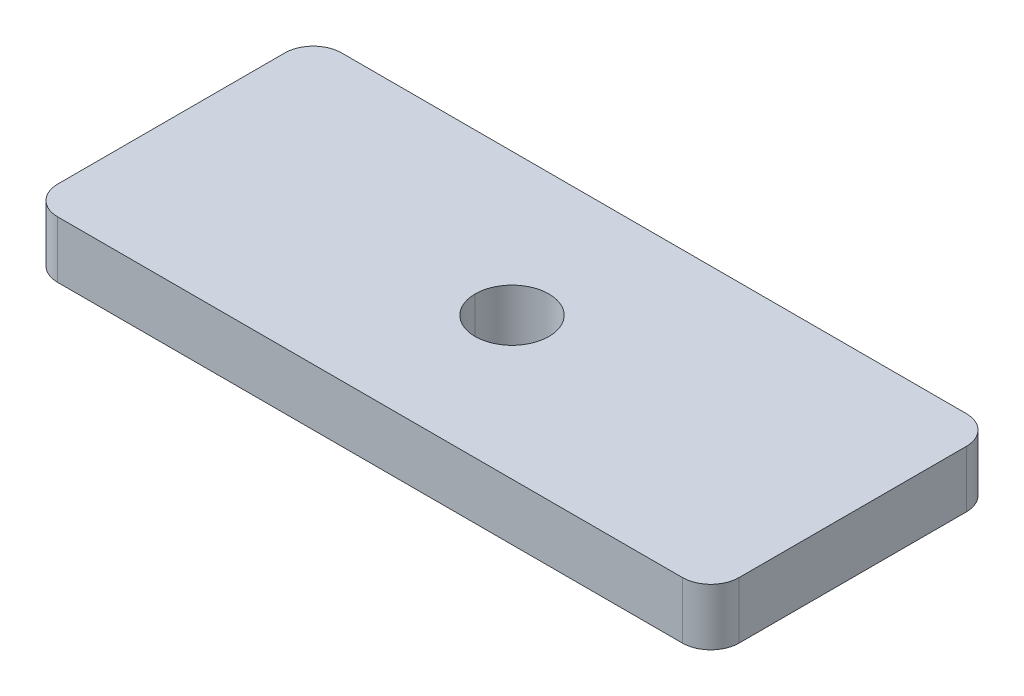
ISO-10303-21;
HEADER;
FILE_DESCRIPTION(('STEP AP214'),'2;1');
FILE_NAME('part.step','',(''),(''),'','','');
FILE_SCHEMA(('AUTOMOTIVE_DESIGN { 1 0 10303 214 1 1 1 1 }'));
ENDSEC;
DATA;
#1=APPLICATION_CONTEXT('core data for automotive mechanical design processes');
#2=APPLICATION_PROTOCOL_DEFINITION('international standard','automotive_design',2000,#1);
#3=PRODUCT_CONTEXT('',#1,'mechanical');
#4=PRODUCT('Part','Part','',(#3));
#5=PRODUCT_RELATED_PRODUCT_CATEGORY('part','',(#4));
#6=PRODUCT_DEFINITION_FORMATION('','',#4);
#7=PRODUCT_DEFINITION_CONTEXT('part definition',#1,'design');
#8=PRODUCT_DEFINITION('design','',#6,#7);
#9=PRODUCT_DEFINITION_SHAPE('','',#8);
#10=(LENGTH_UNIT() NAMED_UNIT(*) SI_UNIT(.MILLI.,.METRE.));
#11=(NAMED_UNIT(*) PLANE_ANGLE_UNIT() SI_UNIT($,.RADIAN.));
#12=(NAMED_UNIT(*) SI_UNIT($,.STERADIAN.) SOLID_ANGLE_UNIT());
#13=UNCERTAINTY_MEASURE_WITH_UNIT(LENGTH_MEASURE(1.E-05),#10,'distance_accuracy_value','');
#14=(GEOMETRIC_REPRESENTATION_CONTEXT(3) GLOBAL_UNCERTAINTY_ASSIGNED_CONTEXT((#13)) GLOBAL_UNIT_ASSIGNED_CONTEXT((#10,
#11,#12)) REPRESENTATION_CONTEXT('',''));
#15=CARTESIAN_POINT('',(0.,0.,0.));
#16=DIRECTION('',(0.,0.,1.));
#17=DIRECTION('',(1.,0.,0.));
#18=AXIS2_PLACEMENT_3D('',#15,#16,#17);
#19=CARTESIAN_POINT('',(-244.16652551426,214.2245784726,10.999999809517));
#20=DIRECTION('',(0.,1.,0.));
#21=DIRECTION('',(-1.,0.,0.));
#22=AXIS2_PLACEMENT_3D('',#19,#20,#21);
#23=CYLINDRICAL_SURFACE('',#22,1.3);
#24=CARTESIAN_POINT('',(-244.16652551426,216.4245808726,10.999999809517));
#25=DIRECTION('',(0.,-1.,0.));
#26=DIRECTION('',(1.,0.,0.));
#27=AXIS2_PLACEMENT_3D('',#24,#25,#26);
#28=CIRCLE('',#27,1.3);
#29=CARTESIAN_POINT('',(-242.86652551426,216.4245808726,10.999999809517));
#30=VERTEX_POINT('',#29);
#31=CARTESIAN_POINT('',(-245.46652551426,216.4245808726,10.999999809517));
#32=VERTEX_POINT('',#31);
#33=EDGE_CURVE('E200',#30,#32,#28,.T.);
#34=ORIENTED_EDGE('',*,*,#33,.F.);
#35=DIRECTION('',(0.,-1.,0.));
#36=VECTOR('',#35,1.);
#37=CARTESIAN_POINT('',(-242.86652551426,216.4245808726,10.999999809517));
#38=LINE('',#37,#36);
#39=CARTESIAN_POINT('',(-242.86652551426,214.4245808726,10.999999809517));
#40=VERTEX_POINT('',#39);
#41=EDGE_CURVE('E23',#30,#40,#38,.T.);
#42=ORIENTED_EDGE('',*,*,#41,.T.);
#43=CARTESIAN_POINT('',(-244.16652551426,214.4245808726,10.999999809517));
#44=DIRECTION('',(0.,1.,0.));
#45=DIRECTION('',(-1.,0.,0.));
#46=AXIS2_PLACEMENT_3D('',#43,#44,#45);
#47=CIRCLE('',#46,1.3);
#48=CARTESIAN_POINT('',(-245.46652551426,214.4245808726,10.999999809517));
#49=VERTEX_POINT('',#48);
#50=EDGE_CURVE('E114',#49,#40,#47,.T.);
#51=ORIENTED_EDGE('',*,*,#50,.F.);
#52=DIRECTION('',(0.,-1.,0.));
#53=VECTOR('',#52,1.);
#54=CARTESIAN_POINT('',(-245.46652551426,216.4245808726,10.999999809517));
#55=LINE('',#54,#53);
#56=EDGE_CURVE('E10',#32,#49,#55,.T.);
#57=ORIENTED_EDGE('',*,*,#56,.F.);
#58=EDGE_LOOP('',(#34,#42,#51,#57));
#59=FACE_BOUND('',#58,.T.);
#60=ADVANCED_FACE('F15',(#59),#23,.F.);
#61=CARTESIAN_POINT('',(-244.16652551426,214.2245784726,10.999999809517));
#62=DIRECTION('',(0.,1.,0.));
#63=DIRECTION('',(-1.,0.,0.));
#64=AXIS2_PLACEMENT_3D('',#61,#62,#63);
#65=CYLINDRICAL_SURFACE('',#64,1.3);
#66=ORIENTED_EDGE('',*,*,#41,.F.);
#67=CARTESIAN_POINT('',(-244.16652551426,216.4245808726,10.999999809517));
#68=DIRECTION('',(0.,-1.,0.));
#69=DIRECTION('',(-1.,0.,0.));
#70=AXIS2_PLACEMENT_3D('',#67,#68,#69);
#71=CIRCLE('',#70,1.3);
#72=EDGE_CURVE('E204',#32,#30,#71,.T.);
#73=ORIENTED_EDGE('',*,*,#72,.F.);
#74=ORIENTED_EDGE('',*,*,#56,.T.);
#75=CARTESIAN_POINT('',(-244.16652551426,214.4245808726,10.999999809517));
#76=DIRECTION('',(0.,1.,0.));
#77=DIRECTION('',(1.,0.,0.));
#78=AXIS2_PLACEMENT_3D('',#75,#76,#77);
#79=CIRCLE('',#78,1.3);
#80=EDGE_CURVE('E151',#40,#49,#79,.T.);
#81=ORIENTED_EDGE('',*,*,#80,.F.);
#82=EDGE_LOOP('',(#66,#73,#74,#81));
#83=FACE_BOUND('',#82,.T.);
#84=ADVANCED_FACE('F209',(#83),#65,.F.);
#85=CARTESIAN_POINT('',(-233.33616287996,216.4245808726,14.391526076047));
#86=DIRECTION('',(0.,1.,0.));
#87=DIRECTION('',(0.,0.,-1.));
#88=AXIS2_PLACEMENT_3D('',#85,#86,#87);
#89=PLANE('',#88);
#90=ORIENTED_EDGE('',*,*,#33,.T.);
#91=ORIENTED_EDGE('',*,*,#72,.T.);
#92=EDGE_LOOP('',(#90,#91));
#93=FACE_BOUND('',#92,.T.);
#94=CARTESIAN_POINT('',(-255.16652551426,216.4245808726,14.999999809517));
#95=DIRECTION('',(0.,1.,0.));
#96=DIRECTION('',(-1.,0.,0.));
#97=AXIS2_PLACEMENT_3D('',#94,#95,#96);
#98=CIRCLE('',#97,1.);
#99=CARTESIAN_POINT('',(-256.16652551426,216.4245808726,14.999999809517));
#100=VERTEX_POINT('',#99);
#101=CARTESIAN_POINT('',(-255.16652551426,216.4245808726,15.999999809517));
#102=VERTEX_POINT('',#101);
#103=EDGE_CURVE('E183',#100,#102,#98,.T.);
#104=ORIENTED_EDGE('',*,*,#103,.T.);
#105=DIRECTION('',(1.,0.,0.));
#106=VECTOR('',#105,1.);
#107=CARTESIAN_POINT('',(-255.16652551426,216.4245808726,15.999999809517));
#108=LINE('',#107,#106);
#109=CARTESIAN_POINT('',(-233.16652551426,216.4245808726,15.999999809517));
#110=VERTEX_POINT('',#109);
#111=EDGE_CURVE('E176',#102,#110,#108,.T.);
#112=ORIENTED_EDGE('',*,*,#111,.T.);
#113=CARTESIAN_POINT('',(-233.16652551426,216.4245808726,14.999999809517));
#114=DIRECTION('',(0.,1.,0.));
#115=DIRECTION('',(0.,0.,1.));
#116=AXIS2_PLACEMENT_3D('',#113,#114,#115);
#117=CIRCLE('',#116,1.);
#118=CARTESIAN_POINT('',(-232.16652551426,216.4245808726,14.999999809517));
#119=VERTEX_POINT('',#118);
#120=EDGE_CURVE('E170',#110,#119,#117,.T.);
#121=ORIENTED_EDGE('',*,*,#120,.T.);
#122=DIRECTION('',(0.,0.,1.));
#123=VECTOR('',#122,1.);
#124=CARTESIAN_POINT('',(-232.16652551426,216.4245808726,6.999999809517));
#125=LINE('',#124,#123);
#126=CARTESIAN_POINT('',(-232.16652551426,216.4245808726,6.999999809517));
#127=VERTEX_POINT('',#126);
#128=EDGE_CURVE('E143',#127,#119,#125,.T.);
#129=ORIENTED_EDGE('',*,*,#128,.F.);
#130=CARTESIAN_POINT('',(-233.16652551426,216.4245808726,6.999999809517));
#131=DIRECTION('',(0.,1.,0.));
#132=DIRECTION('',(1.,0.,0.));
#133=AXIS2_PLACEMENT_3D('',#130,#131,#132);
#134=CIRCLE('',#133,1.);
#135=CARTESIAN_POINT('',(-233.16652551426,216.4245808726,5.999999809517));
#136=VERTEX_POINT('',#135);
#137=EDGE_CURVE('E103',#127,#136,#134,.T.);
#138=ORIENTED_EDGE('',*,*,#137,.T.);
#139=DIRECTION('',(-1.,0.,0.));
#140=VECTOR('',#139,1.);
#141=CARTESIAN_POINT('',(-233.16652551426,216.4245808726,5.999999809517));
#142=LINE('',#141,#140);
#143=CARTESIAN_POINT('',(-255.16652551426,216.4245808726,5.999999809517));
#144=VERTEX_POINT('',#143);
#145=EDGE_CURVE('E98',#136,#144,#142,.T.);
#146=ORIENTED_EDGE('',*,*,#145,.T.);
#147=CARTESIAN_POINT('',(-255.16652551426,216.4245808726,6.999999809517));
#148=DIRECTION('',(0.,1.,0.));
#149=DIRECTION('',(0.,0.,-1.));
#150=AXIS2_PLACEMENT_3D('',#147,#148,#149);
#151=CIRCLE('',#150,1.);
#152=CARTESIAN_POINT('',(-256.16652551426,216.4245808726,6.999999809517));
#153=VERTEX_POINT('',#152);
#154=EDGE_CURVE('E197',#144,#153,#151,.T.);
#155=ORIENTED_EDGE('',*,*,#154,.T.);
#156=DIRECTION('',(0.,0.,-1.));
#157=VECTOR('',#156,1.);
#158=CARTESIAN_POINT('',(-256.16652551426,216.4245808726,14.999999809517));
#159=LINE('',#158,#157);
#160=EDGE_CURVE('E189',#100,#153,#159,.T.);
#161=ORIENTED_EDGE('',*,*,#160,.F.);
#162=EDGE_LOOP('',(#104,#112,#121,#129,#138,#146,#155,#161));
#163=FACE_BOUND('',#162,.T.);
#164=ADVANCED_FACE('F222',(#93,#163),#89,.T.);
#165=CARTESIAN_POINT('',(-255.16652551426,214.4245808726,6.999999809517));
#166=DIRECTION('',(0.,1.,0.));
#167=DIRECTION('',(-1.,0.,0.));
#168=AXIS2_PLACEMENT_3D('',#165,#166,#167);
#169=CYLINDRICAL_SURFACE('',#168,1.);
#170=CARTESIAN_POINT('',(-255.16652551426,214.4245808726,6.999999809517));
#171=DIRECTION('',(0.,-1.,0.));
#172=DIRECTION('',(-1.,0.,0.));
#173=AXIS2_PLACEMENT_3D('',#170,#171,#172);
#174=CIRCLE('',#173,1.);
#175=CARTESIAN_POINT('',(-256.16652551426,214.4245808726,6.999999809517));
#176=VERTEX_POINT('',#175);
#177=CARTESIAN_POINT('',(-255.16652551426,214.4245808726,5.999999809517));
#178=VERTEX_POINT('',#177);
#179=EDGE_CURVE('E112',#176,#178,#174,.T.);
#180=ORIENTED_EDGE('',*,*,#179,.F.);
#181=DIRECTION('',(0.,1.,0.));
#182=VECTOR('',#181,1.);
#183=CARTESIAN_POINT('',(-256.16652551426,214.4245808726,6.999999809517));
#184=LINE('',#183,#182);
#185=EDGE_CURVE('E193',#176,#153,#184,.T.);
#186=ORIENTED_EDGE('',*,*,#185,.T.);
#187=ORIENTED_EDGE('',*,*,#154,.F.);
#188=DIRECTION('',(0.,-1.,0.));
#189=VECTOR('',#188,1.);
#190=CARTESIAN_POINT('',(-255.16652551426,216.4245808726,5.999999809517));
#191=LINE('',#190,#189);
#192=EDGE_CURVE('E158',#144,#178,#191,.T.);
#193=ORIENTED_EDGE('',*,*,#192,.T.);
#194=EDGE_LOOP('',(#180,#186,#187,#193));
#195=FACE_BOUND('',#194,.T.);
#196=ADVANCED_FACE('F227',(#195),#169,.T.);
#197=CARTESIAN_POINT('',(-256.16652551426,214.4245808726,15.999999809517));
#198=DIRECTION('',(-1.,0.,0.));
#199=DIRECTION('',(0.,-1.,0.));
#200=AXIS2_PLACEMENT_3D('',#197,#198,#199);
#201=PLANE('',#200);
#202=ORIENTED_EDGE('',*,*,#160,.T.);
#203=ORIENTED_EDGE('',*,*,#185,.F.);
#204=DIRECTION('',(0.,0.,-1.));
#205=VECTOR('',#204,1.);
#206=CARTESIAN_POINT('',(-256.16652551426,214.4245808726,14.999999809517));
#207=LINE('',#206,#205);
#208=CARTESIAN_POINT('',(-256.16652551426,214.4245808726,14.999999809517));
#209=VERTEX_POINT('',#208);
#210=EDGE_CURVE('E131',#209,#176,#207,.T.);
#211=ORIENTED_EDGE('',*,*,#210,.F.);
#212=DIRECTION('',(0.,-1.,0.));
#213=VECTOR('',#212,1.);
#214=CARTESIAN_POINT('',(-256.16652551426,216.4245808726,14.999999809517));
#215=LINE('',#214,#213);
#216=EDGE_CURVE('E186',#100,#209,#215,.T.);
#217=ORIENTED_EDGE('',*,*,#216,.F.);
#218=EDGE_LOOP('',(#202,#203,#211,#217));
#219=FACE_BOUND('',#218,.T.);
#220=ADVANCED_FACE('F231',(#219),#201,.T.);
#221=CARTESIAN_POINT('',(-255.16652551426,214.4245808726,14.999999809517));
#222=DIRECTION('',(0.,1.,0.));
#223=DIRECTION('',(-1.,0.,0.));
#224=AXIS2_PLACEMENT_3D('',#221,#222,#223);
#225=CYLINDRICAL_SURFACE('',#224,1.);
#226=CARTESIAN_POINT('',(-255.16652551426,214.4245808726,14.999999809517));
#227=DIRECTION('',(0.,-1.,0.));
#228=DIRECTION('',(0.,0.,1.));
#229=AXIS2_PLACEMENT_3D('',#226,#227,#228);
#230=CIRCLE('',#229,1.);
#231=CARTESIAN_POINT('',(-255.16652551426,214.4245808726,15.999999809517));
#232=VERTEX_POINT('',#231);
#233=EDGE_CURVE('E132',#232,#209,#230,.T.);
#234=ORIENTED_EDGE('',*,*,#233,.F.);
#235=DIRECTION('',(0.,1.,0.));
#236=VECTOR('',#235,1.);
#237=CARTESIAN_POINT('',(-255.16652551426,214.4245808726,15.999999809517));
#238=LINE('',#237,#236);
#239=EDGE_CURVE('E179',#232,#102,#238,.T.);
#240=ORIENTED_EDGE('',*,*,#239,.T.);
#241=ORIENTED_EDGE('',*,*,#103,.F.);
#242=ORIENTED_EDGE('',*,*,#216,.T.);
#243=EDGE_LOOP('',(#234,#240,#241,#242));
#244=FACE_BOUND('',#243,.T.);
#245=ADVANCED_FACE('F238',(#244),#225,.T.);
#246=CARTESIAN_POINT('',(-226.66652551426,214.4245808726,15.999999809517));
#247=DIRECTION('',(0.,0.,1.));
#248=DIRECTION('',(-1.,0.,0.));
#249=AXIS2_PLACEMENT_3D('',#246,#247,#248);
#250=PLANE('',#249);
#251=ORIENTED_EDGE('',*,*,#111,.F.);
#252=ORIENTED_EDGE('',*,*,#239,.F.);
#253=DIRECTION('',(1.,0.,0.));
#254=VECTOR('',#253,1.);
#255=CARTESIAN_POINT('',(-255.16652551426,214.4245808726,15.999999809517));
#256=LINE('',#255,#254);
#257=CARTESIAN_POINT('',(-233.16652551426,214.4245808726,15.999999809517));
#258=VERTEX_POINT('',#257);
#259=EDGE_CURVE('E138',#232,#258,#256,.T.);
#260=ORIENTED_EDGE('',*,*,#259,.T.);
#261=DIRECTION('',(0.,-1.,0.));
#262=VECTOR('',#261,1.);
#263=CARTESIAN_POINT('',(-233.16652551426,216.4245808726,15.999999809517));
#264=LINE('',#263,#262);
#265=EDGE_CURVE('E173',#110,#258,#264,.T.);
#266=ORIENTED_EDGE('',*,*,#265,.F.);
#267=EDGE_LOOP('',(#251,#252,#260,#266));
#268=FACE_BOUND('',#267,.T.);
#269=ADVANCED_FACE('F255',(#268),#250,.T.);
#270=CARTESIAN_POINT('',(-233.16652551426,214.4245808726,14.999999809517));
#271=DIRECTION('',(0.,1.,0.));
#272=DIRECTION('',(-1.,0.,0.));
#273=AXIS2_PLACEMENT_3D('',#270,#271,#272);
#274=CYLINDRICAL_SURFACE('',#273,1.);
#275=CARTESIAN_POINT('',(-233.16652551426,214.4245808726,14.999999809517));
#276=DIRECTION('',(0.,-1.,0.));
#277=DIRECTION('',(1.,0.,0.));
#278=AXIS2_PLACEMENT_3D('',#275,#276,#277);
#279=CIRCLE('',#278,1.);
#280=CARTESIAN_POINT('',(-232.16652551426,214.4245808726,14.999999809517));
#281=VERTEX_POINT('',#280);
#282=EDGE_CURVE('E128',#281,#258,#279,.T.);
#283=ORIENTED_EDGE('',*,*,#282,.F.);
#284=DIRECTION('',(0.,1.,0.));
#285=VECTOR('',#284,1.);
#286=CARTESIAN_POINT('',(-232.16652551426,214.4245808726,14.999999809517));
#287=LINE('',#286,#285);
#288=EDGE_CURVE('E147',#281,#119,#287,.T.);
#289=ORIENTED_EDGE('',*,*,#288,.T.);
#290=ORIENTED_EDGE('',*,*,#120,.F.);
#291=ORIENTED_EDGE('',*,*,#265,.T.);
#292=EDGE_LOOP('',(#283,#289,#290,#291));
#293=FACE_BOUND('',#292,.T.);
#294=ADVANCED_FACE('F251',(#293),#274,.T.);
#295=CARTESIAN_POINT('',(-232.16652551426,214.4245808726,5.999999809517));
#296=DIRECTION('',(1.,0.,0.));
#297=DIRECTION('',(0.,0.,1.));
#298=AXIS2_PLACEMENT_3D('',#295,#296,#297);
#299=PLANE('',#298);
#300=DIRECTION('',(0.,-1.,0.));
#301=VECTOR('',#300,1.);
#302=CARTESIAN_POINT('',(-232.16652551426,216.4245808726,6.999999809517));
#303=LINE('',#302,#301);
#304=CARTESIAN_POINT('',(-232.16652551426,214.4245808726,6.999999809517));
#305=VERTEX_POINT('',#304);
#306=EDGE_CURVE('E118',#127,#305,#303,.T.);
#307=ORIENTED_EDGE('',*,*,#306,.F.);
#308=ORIENTED_EDGE('',*,*,#128,.T.);
#309=ORIENTED_EDGE('',*,*,#288,.F.);
#310=DIRECTION('',(0.,0.,1.));
#311=VECTOR('',#310,1.);
#312=CARTESIAN_POINT('',(-232.16652551426,214.4245808726,6.999999809517));
#313=LINE('',#312,#311);
#314=EDGE_CURVE('E121',#305,#281,#313,.T.);
#315=ORIENTED_EDGE('',*,*,#314,.F.);
#316=EDGE_LOOP('',(#307,#308,#309,#315));
#317=FACE_BOUND('',#316,.T.);
#318=ADVANCED_FACE('F248',(#317),#299,.T.);
#319=CARTESIAN_POINT('',(-233.16652551426,214.4245808726,6.999999809517));
#320=DIRECTION('',(0.,1.,0.));
#321=DIRECTION('',(-1.,0.,0.));
#322=AXIS2_PLACEMENT_3D('',#319,#320,#321);
#323=CYLINDRICAL_SURFACE('',#322,1.);
#324=ORIENTED_EDGE('',*,*,#137,.F.);
#325=ORIENTED_EDGE('',*,*,#306,.T.);
#326=CARTESIAN_POINT('',(-233.16652551426,214.4245808726,6.999999809517));
#327=DIRECTION('',(0.,-1.,0.));
#328=DIRECTION('',(0.,0.,-1.));
#329=AXIS2_PLACEMENT_3D('',#326,#327,#328);
#330=CIRCLE('',#329,1.);
#331=CARTESIAN_POINT('',(-233.16652551426,214.4245808726,5.999999809517));
#332=VERTEX_POINT('',#331);
#333=EDGE_CURVE('E109',#332,#305,#330,.T.);
#334=ORIENTED_EDGE('',*,*,#333,.F.);
#335=DIRECTION('',(0.,1.,0.));
#336=VECTOR('',#335,1.);
#337=CARTESIAN_POINT('',(-233.16652551426,214.4245808726,5.999999809517));
#338=LINE('',#337,#336);
#339=EDGE_CURVE('E91',#332,#136,#338,.T.);
#340=ORIENTED_EDGE('',*,*,#339,.T.);
#341=EDGE_LOOP('',(#324,#325,#334,#340));
#342=FACE_BOUND('',#341,.T.);
#343=ADVANCED_FACE('F116',(#342),#323,.T.);
#344=CARTESIAN_POINT('',(-261.66652551426,214.4245808726,5.999999809517));
#345=DIRECTION('',(0.,0.,-1.));
#346=DIRECTION('',(0.,1.,0.));
#347=AXIS2_PLACEMENT_3D('',#344,#345,#346);
#348=PLANE('',#347);
#349=DIRECTION('',(-1.,0.,0.));
#350=VECTOR('',#349,1.);
#351=CARTESIAN_POINT('',(-233.16652551426,214.4245808726,5.999999809517));
#352=LINE('',#351,#350);
#353=EDGE_CURVE('E95',#332,#178,#352,.T.);
#354=ORIENTED_EDGE('',*,*,#353,.T.);
#355=ORIENTED_EDGE('',*,*,#192,.F.);
#356=ORIENTED_EDGE('',*,*,#145,.F.);
#357=ORIENTED_EDGE('',*,*,#339,.F.);
#358=EDGE_LOOP('',(#354,#355,#356,#357));
#359=FACE_BOUND('',#358,.T.);
#360=ADVANCED_FACE('F93',(#359),#348,.T.);
#361=CARTESIAN_POINT('',(-233.33616287996,214.4245808726,14.391526076047));
#362=DIRECTION('',(0.,1.,0.));
#363=DIRECTION('',(0.,0.,-1.));
#364=AXIS2_PLACEMENT_3D('',#361,#362,#363);
#365=PLANE('',#364);
#366=ORIENTED_EDGE('',*,*,#50,.T.);
#367=ORIENTED_EDGE('',*,*,#80,.T.);
#368=EDGE_LOOP('',(#366,#367));
#369=FACE_BOUND('',#368,.T.);
#370=ORIENTED_EDGE('',*,*,#333,.T.);
#371=ORIENTED_EDGE('',*,*,#314,.T.);
#372=ORIENTED_EDGE('',*,*,#282,.T.);
#373=ORIENTED_EDGE('',*,*,#259,.F.);
#374=ORIENTED_EDGE('',*,*,#233,.T.);
#375=ORIENTED_EDGE('',*,*,#210,.T.);
#376=ORIENTED_EDGE('',*,*,#179,.T.);
#377=ORIENTED_EDGE('',*,*,#353,.F.);
#378=EDGE_LOOP('',(#370,#371,#372,#373,#374,#375,#376,#377));
#379=FACE_BOUND('',#378,.T.);
#380=ADVANCED_FACE('F107',(#369,#379),#365,.F.);
#381=CLOSED_SHELL('',(#60,#84,#164,#196,#220,#245,#269,#294,#318,#343,#360,#380));
#382=MANIFOLD_SOLID_BREP('B1',#381);
#383=ADVANCED_BREP_SHAPE_REPRESENTATION('',(#18,#382),#14);
#384=SHAPE_DEFINITION_REPRESENTATION(#9,#383);
ENDSEC;
END-ISO-10303-21;
